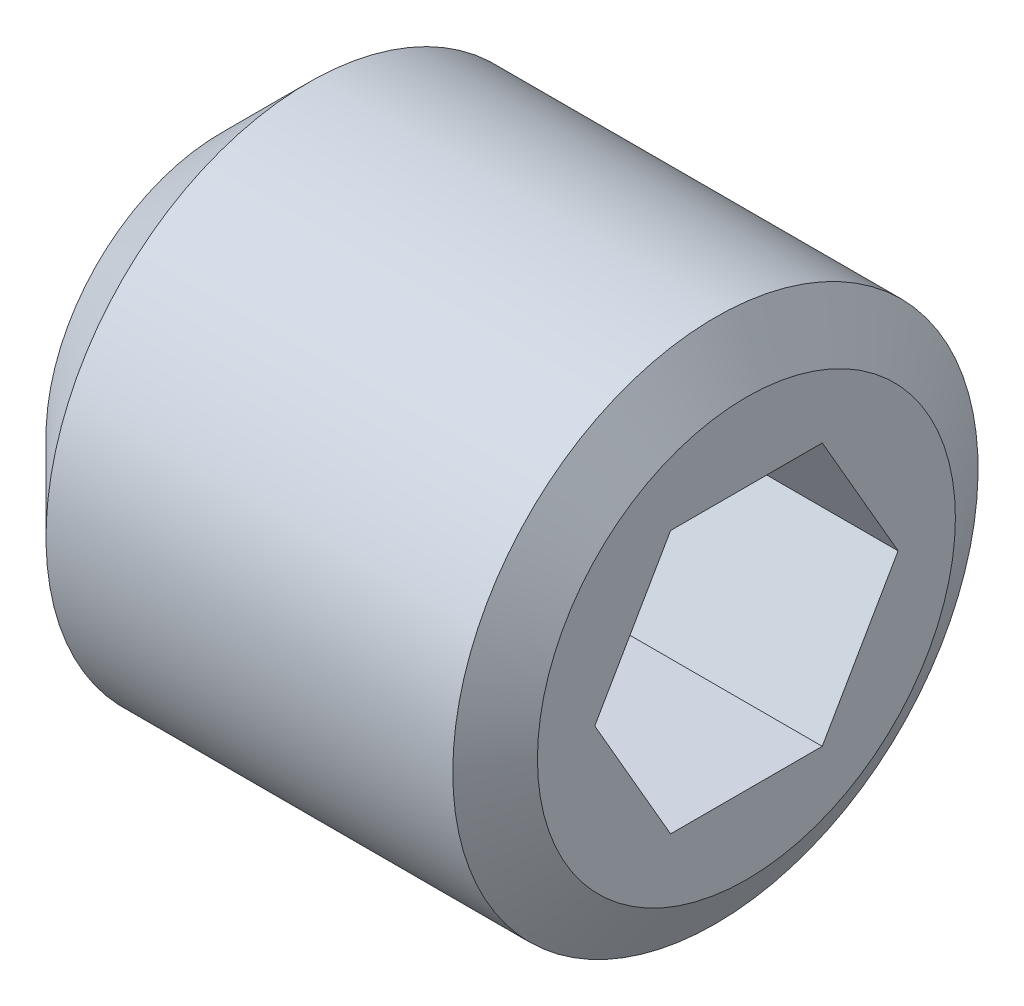
ISO-10303-21;
HEADER;
FILE_DESCRIPTION(('STEP AP214'),'2;1');
FILE_NAME('part.step','',(''),(''),'','','');
FILE_SCHEMA(('AUTOMOTIVE_DESIGN { 1 0 10303 214 1 1 1 1 }'));
ENDSEC;
DATA;
#1=APPLICATION_CONTEXT('core data for automotive mechanical design processes');
#2=APPLICATION_PROTOCOL_DEFINITION('international standard','automotive_design',2000,#1);
#3=PRODUCT_CONTEXT('',#1,'mechanical');
#4=PRODUCT('Part','Part','',(#3));
#5=PRODUCT_RELATED_PRODUCT_CATEGORY('part','',(#4));
#6=PRODUCT_DEFINITION_FORMATION('','',#4);
#7=PRODUCT_DEFINITION_CONTEXT('part definition',#1,'design');
#8=PRODUCT_DEFINITION('design','',#6,#7);
#9=PRODUCT_DEFINITION_SHAPE('','',#8);
#10=(LENGTH_UNIT() NAMED_UNIT(*) SI_UNIT(.MILLI.,.METRE.));
#11=(NAMED_UNIT(*) PLANE_ANGLE_UNIT() SI_UNIT($,.RADIAN.));
#12=(NAMED_UNIT(*) SI_UNIT($,.STERADIAN.) SOLID_ANGLE_UNIT());
#13=UNCERTAINTY_MEASURE_WITH_UNIT(LENGTH_MEASURE(1.E-05),#10,'distance_accuracy_value','');
#14=(GEOMETRIC_REPRESENTATION_CONTEXT(3) GLOBAL_UNCERTAINTY_ASSIGNED_CONTEXT((#13)) GLOBAL_UNIT_ASSIGNED_CONTEXT((#10,
#11,#12)) REPRESENTATION_CONTEXT('',''));
#15=CARTESIAN_POINT('',(0.,0.,0.));
#16=DIRECTION('',(0.,0.,1.));
#17=DIRECTION('',(1.,0.,0.));
#18=AXIS2_PLACEMENT_3D('',#15,#16,#17);
#19=CARTESIAN_POINT('',(1.8030007785228,0.,0.));
#20=DIRECTION('',(1.,0.,0.));
#21=DIRECTION('',(0.,0.,-1.));
#22=AXIS2_PLACEMENT_3D('',#19,#20,#21);
#23=CONICAL_SURFACE('',#22,0.871447499719181,1.04719754996775);
#24=CARTESIAN_POINT('',(1.80000000052929,-0.75019450614879,0.433124999847265));
#25=CARTESIAN_POINT('',(1.78973500393453,-0.75019450607153,0.397569732212472));
#26=CARTESIAN_POINT('',(1.78033710994484,-0.750194506039836,0.361733190852161));
#27=CARTESIAN_POINT('',(1.76372749838168,-0.750194506016601,0.289477968335062));
#28=CARTESIAN_POINT('',(1.75652067224446,-0.750194506025149,0.253058173000704));
#29=CARTESIAN_POINT('',(1.74493122333237,-0.750194506031242,0.180627245017424));
#30=CARTESIAN_POINT('',(1.74048681046706,-0.750194506029037,0.144626310065431));
#31=CARTESIAN_POINT('',(1.73452044980539,-0.750194506027426,0.0724167378183757));
#32=CARTESIAN_POINT('',(1.73299532977673,-0.750194506028015,0.0362083689083727));
#33=CARTESIAN_POINT('',(1.73299532977656,-0.750194506028447,-0.03620836891302));
#34=CARTESIAN_POINT('',(1.73452044980516,-0.750194506028289,-0.0724167378244096));
#35=CARTESIAN_POINT('',(1.74048681046847,-0.750194506028173,-0.144626310073646));
#36=CARTESIAN_POINT('',(1.74493122333547,-0.750194506028214,-0.180627245026433));
#37=CARTESIAN_POINT('',(1.75652067224474,-0.750194506028248,-0.253058173013071));
#38=CARTESIAN_POINT('',(1.7637274983773,-0.75019450602824,-0.28947796835003));
#39=CARTESIAN_POINT('',(1.78033710995589,-0.750194506028222,-0.361733190866283));
#40=CARTESIAN_POINT('',(1.78973500396563,-0.750194506028214,-0.397569732223154));
#41=CARTESIAN_POINT('',(1.80000000060822,-0.750194506028231,-0.433124999847262));
#42=B_SPLINE_CURVE_WITH_KNOTS('',3,(#24,#25,#26,#27,#28,#29,#30,#31,#32,#33,#34,#35,#36,#37,#38,
#39,#40,#41),.UNSPECIFIED.,.F.,.F.,(4,2,2,2,2,2,2,2,4),(0.,0.111056317466205,0.222358771597824,
0.331072410599408,0.439667849355641,0.548263288115687,0.656976927120826,0.768279381256422,
0.879335698727773),.UNSPECIFIED.);
#43=CARTESIAN_POINT('',(1.80000000060215,-0.750194505952962,0.433124999956606));
#44=VERTEX_POINT('',#43);
#45=CARTESIAN_POINT('',(1.80000000060215,-0.750194505952961,-0.433124999956601));
#46=VERTEX_POINT('',#45);
#47=EDGE_CURVE('E107',#44,#46,#42,.T.);
#48=ORIENTED_EDGE('',*,*,#47,.T.);
#49=CARTESIAN_POINT('',(1.80000000052929,-0.750194505956184,-0.433125000180862));
#50=CARTESIAN_POINT('',(1.78900797888272,-0.717228000924657,-0.452158220645845));
#51=CARTESIAN_POINT('',(1.77901131138609,-0.68397692932451,-0.471355735748436));
#52=CARTESIAN_POINT('',(1.76156242914315,-0.616899065951832,-0.510083158196485));
#53=CARTESIAN_POINT('',(1.75411638647812,-0.583071082723161,-0.529613753429577));
#54=CARTESIAN_POINT('',(1.74252608377005,-0.515834329634083,-0.568432910932016));
#55=CARTESIAN_POINT('',(1.73830467485833,-0.48243590210932,-0.587715502051405));
#56=CARTESIAN_POINT('',(1.7332661360862,-0.415481978381465,-0.626371367937135));
#57=CARTESIAN_POINT('',(1.73244483287884,-0.38192672537074,-0.645744502296295));
#58=CARTESIAN_POINT('',(1.73415778811296,-0.31923233487878,-0.681941125523941));
#59=CARTESIAN_POINT('',(1.73627145928134,-0.290083789592266,-0.698770045991449));
#60=CARTESIAN_POINT('',(1.74296920165886,-0.231976592282876,-0.732318251999771));
#61=CARTESIAN_POINT('',(1.74755555856444,-0.203018141087275,-0.749037421592904));
#62=CARTESIAN_POINT('',(1.75902056313261,-0.144791237470451,-0.782654740070188));
#63=CARTESIAN_POINT('',(1.76594778752534,-0.115530150732132,-0.799548636375329));
#64=CARTESIAN_POINT('',(1.78166965830922,-0.0574442801405555,-0.833084529397474));
#65=CARTESIAN_POINT('',(1.79046061305762,-0.0286187527141861,-0.849726955416613));
#66=CARTESIAN_POINT('',(1.80000000060772,-1.33824524092478E-10,-0.866249999922772));
#67=B_SPLINE_CURVE_WITH_KNOTS('',3,(#49,#50,#51,#52,#53,#54,#55,#56,#57,#58,#59,#60,#61,#62,#63,
#64,#65,#66),.UNSPECIFIED.,.F.,.F.,(4,2,2,2,2,2,2,2,4),(0.,0.118911835151596,0.2381094171165,
0.354357228103174,0.470462312189687,0.571538603718614,0.672708488550432,0.776121836634316,
0.879332227969691),.UNSPECIFIED.);
#68=CARTESIAN_POINT('',(1.80000000060219,1.06549945254002E-13,-0.8662499999132));
#69=VERTEX_POINT('',#68);
#70=EDGE_CURVE('E90',#46,#69,#67,.T.);
#71=ORIENTED_EDGE('',*,*,#70,.T.);
#72=CARTESIAN_POINT('',(1.80000000052935,1.92704234142296E-10,-0.866250000028126));
#73=CARTESIAN_POINT('',(1.78900797888277,0.0329665051469793,-0.847216779429332));
#74=CARTESIAN_POINT('',(1.77901131138614,0.0662175767154377,-0.828019264271846));
#75=CARTESIAN_POINT('',(1.7615624291432,0.133295440064887,-0.789291841783547));
#76=CARTESIAN_POINT('',(1.75411638647817,0.167123423302115,-0.769761246565267));
#77=CARTESIAN_POINT('',(1.7425260837701,0.234360176397283,-0.730942089073358));
#78=CARTESIAN_POINT('',(1.73830467485837,0.267758603919847,-0.711659497950152));
#79=CARTESIAN_POINT('',(1.73326613608624,0.334712527646109,-0.673003632061645));
#80=CARTESIAN_POINT('',(1.73244483287888,0.368267780657437,-0.653630497703521));
#81=CARTESIAN_POINT('',(1.734157788113,0.430962171149776,-0.617433874476522));
#82=CARTESIAN_POINT('',(1.73627145928139,0.460110716436162,-0.600604954008794));
#83=CARTESIAN_POINT('',(1.74296920165891,0.518217913745457,-0.567056748000309));
#84=CARTESIAN_POINT('',(1.74755555856448,0.547176364941091,-0.550337578407234));
#85=CARTESIAN_POINT('',(1.75902056313265,0.605403268557943,-0.516720259929997));
#86=CARTESIAN_POINT('',(1.76594778752538,0.634664355296254,-0.499826363624844));
#87=CARTESIAN_POINT('',(1.78166965830927,0.692750225887817,-0.466290470602676));
#88=CARTESIAN_POINT('',(1.79046061305766,0.721575753314179,-0.449648044583524));
#89=CARTESIAN_POINT('',(1.80000000060776,0.750194505894554,-0.433125000077389));
#90=B_SPLINE_CURVE_WITH_KNOTS('',3,(#72,#73,#74,#75,#76,#77,#78,#79,#80,#81,#82,#83,#84,#85,#86,
#87,#88,#89),.UNSPECIFIED.,.F.,.F.,(4,2,2,2,2,2,2,2,4),(0.,0.11891183515161,0.238109417116527,
0.354357228103215,0.470462312189741,0.571538603718667,0.672708488550483,0.776121836634368,
0.879332227969741),.UNSPECIFIED.);
#91=CARTESIAN_POINT('',(1.80000000060222,0.750194505953217,-0.433124999956605));
#92=VERTEX_POINT('',#91);
#93=EDGE_CURVE('E87',#69,#92,#90,.T.);
#94=ORIENTED_EDGE('',*,*,#93,.T.);
#95=CARTESIAN_POINT('',(1.80000000052936,0.750194506149042,-0.433124999847266));
#96=CARTESIAN_POINT('',(1.7897350039346,0.750194506071784,-0.397569732212473));
#97=CARTESIAN_POINT('',(1.78033710994491,0.75019450604009,-0.361733190852163));
#98=CARTESIAN_POINT('',(1.76372749838176,0.750194506016855,-0.289477968335064));
#99=CARTESIAN_POINT('',(1.75652067224453,0.750194506025403,-0.253058173000706));
#100=CARTESIAN_POINT('',(1.74493122333245,0.750194506031496,-0.180627245017427));
#101=CARTESIAN_POINT('',(1.74048681046714,0.750194506029291,-0.144626310065434));
#102=CARTESIAN_POINT('',(1.73452044980547,0.75019450602768,-0.0724167378183801));
#103=CARTESIAN_POINT('',(1.73299532977681,0.750194506028269,-0.0362083689083774));
#104=CARTESIAN_POINT('',(1.73299532977664,0.750194506028701,0.0362083689130154));
#105=CARTESIAN_POINT('',(1.73452044980524,0.750194506028543,0.0724167378244055));
#106=CARTESIAN_POINT('',(1.74048681046855,0.750194506028427,0.144626310073643));
#107=CARTESIAN_POINT('',(1.74493122333555,0.750194506028468,0.180627245026431));
#108=CARTESIAN_POINT('',(1.75652067224481,0.750194506028502,0.25305817301307));
#109=CARTESIAN_POINT('',(1.76372749837738,0.750194506028494,0.289477968350029));
#110=CARTESIAN_POINT('',(1.78033710995596,0.750194506028476,0.361733190866283));
#111=CARTESIAN_POINT('',(1.7897350039657,0.750194506028468,0.397569732223155));
#112=CARTESIAN_POINT('',(1.80000000060829,0.750194506028485,0.433124999847263));
#113=B_SPLINE_CURVE_WITH_KNOTS('',3,(#95,#96,#97,#98,#99,#100,#101,#102,#103,#104,#105,#106,
#107,#108,#109,#110,#111,#112),.UNSPECIFIED.,.F.,.F.,(4,2,2,2,2,2,2,2,4),(0.,0.111056317466204,
0.222358771597821,0.331072410599403,0.439667849355635,0.548263288115682,0.656976927120823,
0.76827938125642,0.879335698727771),.UNSPECIFIED.);
#114=CARTESIAN_POINT('',(1.80000000062731,0.750194506028485,0.433124999913145));
#115=VERTEX_POINT('',#114);
#116=EDGE_CURVE('E21',#92,#115,#113,.T.);
#117=ORIENTED_EDGE('',*,*,#116,.T.);
#118=CARTESIAN_POINT('',(1.80000000052936,0.750194505956439,0.433125000180861));
#119=CARTESIAN_POINT('',(1.78900797888279,0.717228000924908,0.452158220645846));
#120=CARTESIAN_POINT('',(1.77901131138616,0.683976929324757,0.471355735748441));
#121=CARTESIAN_POINT('',(1.76156242914321,0.61689906595207,0.510083158196494));
#122=CARTESIAN_POINT('',(1.75411638647818,0.583071082723394,0.529613753429588));
#123=CARTESIAN_POINT('',(1.7425260837701,0.515834329634307,0.568432910932033));
#124=CARTESIAN_POINT('',(1.73830467485838,0.48243590210954,0.587715502051424));
#125=CARTESIAN_POINT('',(1.73326613608624,0.415481978381676,0.62637136793716));
#126=CARTESIAN_POINT('',(1.73244483287888,0.381926725370947,0.645744502296323));
#127=CARTESIAN_POINT('',(1.73415778811299,0.319232334878983,0.68194112552397));
#128=CARTESIAN_POINT('',(1.73627145928138,0.290083789592471,0.698770045991477));
#129=CARTESIAN_POINT('',(1.74296920165889,0.231976592283086,0.732318251999796));
#130=CARTESIAN_POINT('',(1.74755555856447,0.203018141087487,0.749037421592929));
#131=CARTESIAN_POINT('',(1.75902056313263,0.144791237470666,0.78265474007021));
#132=CARTESIAN_POINT('',(1.76594778752536,0.115530150732349,0.79954863637535));
#133=CARTESIAN_POINT('',(1.78166965830924,0.057444280140776,0.833084529397493));
#134=CARTESIAN_POINT('',(1.79046061305763,0.0286187527144083,0.849726955416631));
#135=CARTESIAN_POINT('',(1.80000000060773,1.34048395759484E-10,0.86624999992279));
#136=B_SPLINE_CURVE_WITH_KNOTS('',3,(#118,#119,#120,#121,#122,#123,#124,#125,#126,#127,#128,
#129,#130,#131,#132,#133,#134,#135),.UNSPECIFIED.,.F.,.F.,(4,2,2,2,2,2,2,2,4),(0.,
0.118911835151612,0.238109417116533,0.354357228103224,0.470462312189753,0.571538603718672,
0.672708488550483,0.77612183663436,0.879332227969726),.UNSPECIFIED.);
#137=CARTESIAN_POINT('',(1.80000000060219,1.16941508169521E-13,0.8662499999132));
#138=VERTEX_POINT('',#137);
#139=EDGE_CURVE('E116',#115,#138,#136,.T.);
#140=ORIENTED_EDGE('',*,*,#139,.T.);
#141=CARTESIAN_POINT('',(1.80000000052933,-1.92484257966868E-10,0.86625000002812));
#142=CARTESIAN_POINT('',(1.78900797888276,-0.0329665051467544,0.84721677942932));
#143=CARTESIAN_POINT('',(1.77901131138613,-0.0662175767152096,0.828019264271832));
#144=CARTESIAN_POINT('',(1.76156242914318,-0.133295440064654,0.789291841783533));
#145=CARTESIAN_POINT('',(1.75411638647815,-0.167123423301881,0.769761246565254));
#146=CARTESIAN_POINT('',(1.74252608377007,-0.234360176397046,0.730942089073348));
#147=CARTESIAN_POINT('',(1.73830467485834,-0.267758603919609,0.711659497950143));
#148=CARTESIAN_POINT('',(1.73326613608621,-0.334712527645868,0.673003632061638));
#149=CARTESIAN_POINT('',(1.73244483287884,-0.368267780657194,0.653630497703514));
#150=CARTESIAN_POINT('',(1.73415778811296,-0.430962171149531,0.617433874476517));
#151=CARTESIAN_POINT('',(1.73627145928134,-0.460110716435916,0.60060495400879));
#152=CARTESIAN_POINT('',(1.74296920165885,-0.518217913745209,0.567056748000306));
#153=CARTESIAN_POINT('',(1.74755555856443,-0.547176364940842,0.550337578407231));
#154=CARTESIAN_POINT('',(1.75902056313259,-0.605403268557692,0.516720259929996));
#155=CARTESIAN_POINT('',(1.76594778752532,-0.634664355296002,0.499826363624844));
#156=CARTESIAN_POINT('',(1.7816696583092,-0.692750225887563,0.466290470602676));
#157=CARTESIAN_POINT('',(1.79046061305759,-0.721575753313925,0.449648044583526));
#158=CARTESIAN_POINT('',(1.80000000060769,-0.750194505894299,0.433125000077391));
#159=B_SPLINE_CURVE_WITH_KNOTS('',3,(#141,#142,#143,#144,#145,#146,#147,#148,#149,#150,#151,
#152,#153,#154,#155,#156,#157,#158),.UNSPECIFIED.,.F.,.F.,(4,2,2,2,2,2,2,2,4),(0.,
0.118911835151605,0.238109417116518,0.354357228103201,0.470462312189723,0.571538603718644,
0.672708488550457,0.776121836634336,0.879332227969706),.UNSPECIFIED.);
#160=EDGE_CURVE('E112',#138,#44,#159,.T.);
#161=ORIENTED_EDGE('',*,*,#160,.T.);
#162=EDGE_LOOP('',(#48,#71,#94,#117,#140,#161));
#163=FACE_BOUND('',#162,.T.);
#164=CARTESIAN_POINT('',(1.29987032855183,-1.4210854715202E-10,0.));
#165=VERTEX_POINT('',#164);
#166=VERTEX_LOOP('',#165);
#167=FACE_BOUND('',#166,.T.);
#168=ADVANCED_FACE('F17',(#163,#167),#23,.F.);
#169=CARTESIAN_POINT('',(2.99999999999996,0.750194506028485,-0.433125000000058));
#170=DIRECTION('',(0.,1.,0.));
#171=DIRECTION('',(0.,0.,1.));
#172=AXIS2_PLACEMENT_3D('',#169,#170,#171);
#173=PLANE('',#172);
#174=DIRECTION('',(1.,0.,0.));
#175=VECTOR('',#174,1.);
#176=CARTESIAN_POINT('',(2.99999999999996,0.750194506028488,-0.433125000000063));
#177=LINE('',#176,#175);
#178=CARTESIAN_POINT('',(2.99999999999998,0.750194506028486,-0.43312500000006));
#179=VERTEX_POINT('',#178);
#180=EDGE_CURVE('E79',#92,#179,#177,.T.);
#181=ORIENTED_EDGE('',*,*,#180,.T.);
#182=DIRECTION('',(0.,0.,-1.));
#183=VECTOR('',#182,1.);
#184=CARTESIAN_POINT('',(2.99999999999999,0.750194506028485,0.));
#185=LINE('',#184,#183);
#186=CARTESIAN_POINT('',(2.99999999999996,0.750194506028485,0.433125000000058));
#187=VERTEX_POINT('',#186);
#188=EDGE_CURVE('E125',#187,#179,#185,.T.);
#189=ORIENTED_EDGE('',*,*,#188,.F.);
#190=DIRECTION('',(1.,0.,0.));
#191=VECTOR('',#190,1.);
#192=CARTESIAN_POINT('',(2.99999999999996,0.750194506028485,0.433125000000058));
#193=LINE('',#192,#191);
#194=EDGE_CURVE('E82',#187,#115,#193,.F.);
#195=ORIENTED_EDGE('',*,*,#194,.T.);
#196=ORIENTED_EDGE('',*,*,#116,.F.);
#197=EDGE_LOOP('',(#181,#189,#195,#196));
#198=FACE_BOUND('',#197,.T.);
#199=ADVANCED_FACE('F76',(#198),#173,.F.);
#200=CARTESIAN_POINT('',(2.99999999999996,1.278976868E-13,-0.866250000000117));
#201=DIRECTION('',(0.,0.500000000000002,-0.866025403784438));
#202=DIRECTION('',(0.,0.866025403784438,0.500000000000002));
#203=AXIS2_PLACEMENT_3D('',#200,#201,#202);
#204=PLANE('',#203);
#205=DIRECTION('',(1.,0.,0.));
#206=VECTOR('',#205,1.);
#207=CARTESIAN_POINT('',(2.99999999999996,1.2045486136314E-13,-0.866250000000105));
#208=LINE('',#207,#206);
#209=CARTESIAN_POINT('',(2.99999999999998,1.22869670031558E-13,-0.86625000000011));
#210=VERTEX_POINT('',#209);
#211=EDGE_CURVE('E93',#69,#210,#208,.T.);
#212=ORIENTED_EDGE('',*,*,#211,.T.);
#213=DIRECTION('',(0.,-0.866025403784435,-0.500000000000007));
#214=VECTOR('',#213,1.);
#215=CARTESIAN_POINT('',(2.99999999999999,0.750194506028485,-0.433125000000058));
#216=LINE('',#215,#214);
#217=EDGE_CURVE('E96',#179,#210,#216,.T.);
#218=ORIENTED_EDGE('',*,*,#217,.F.);
#219=ORIENTED_EDGE('',*,*,#180,.F.);
#220=ORIENTED_EDGE('',*,*,#93,.F.);
#221=EDGE_LOOP('',(#212,#218,#219,#220));
#222=FACE_BOUND('',#221,.T.);
#223=ADVANCED_FACE('F94',(#222),#204,.F.);
#224=CARTESIAN_POINT('',(2.99999999999996,-0.750194506028231,-0.433125000000058));
#225=DIRECTION('',(0.,-0.5,-0.866025403784439));
#226=DIRECTION('',(0.,0.866025403784439,-0.5));
#227=AXIS2_PLACEMENT_3D('',#224,#225,#226);
#228=PLANE('',#227);
#229=DIRECTION('',(1.,0.,0.));
#230=VECTOR('',#229,1.);
#231=CARTESIAN_POINT('',(2.99999999999996,-0.750194506028231,-0.433125000000058));
#232=LINE('',#231,#230);
#233=CARTESIAN_POINT('',(2.99999999999998,-0.750194506028231,-0.433125000000058));
#234=VERTEX_POINT('',#233);
#235=EDGE_CURVE('E105',#46,#234,#232,.T.);
#236=ORIENTED_EDGE('',*,*,#235,.T.);
#237=DIRECTION('',(0.,-0.866025403784435,0.500000000000006));
#238=VECTOR('',#237,1.);
#239=CARTESIAN_POINT('',(2.99999999999999,1.2793585635329E-13,-0.866250000000117));
#240=LINE('',#239,#238);
#241=EDGE_CURVE('E143',#210,#234,#240,.T.);
#242=ORIENTED_EDGE('',*,*,#241,.F.);
#243=ORIENTED_EDGE('',*,*,#211,.F.);
#244=ORIENTED_EDGE('',*,*,#70,.F.);
#245=EDGE_LOOP('',(#236,#242,#243,#244));
#246=FACE_BOUND('',#245,.T.);
#247=ADVANCED_FACE('F193',(#246),#228,.F.);
#248=CARTESIAN_POINT('',(2.99999999999996,-0.750194506028231,0.433125000000058));
#249=DIRECTION('',(0.,-1.,0.));
#250=DIRECTION('',(0.,0.,-1.));
#251=AXIS2_PLACEMENT_3D('',#248,#249,#250);
#252=PLANE('',#251);
#253=DIRECTION('',(1.,0.,0.));
#254=VECTOR('',#253,1.);
#255=CARTESIAN_POINT('',(2.99999999999996,-0.750194506028234,0.433125000000064));
#256=LINE('',#255,#254);
#257=CARTESIAN_POINT('',(2.99999999999998,-0.750194506028233,0.433125000000061));
#258=VERTEX_POINT('',#257);
#259=EDGE_CURVE('E110',#44,#258,#256,.T.);
#260=ORIENTED_EDGE('',*,*,#259,.T.);
#261=DIRECTION('',(0.,0.,-1.));
#262=VECTOR('',#261,1.);
#263=CARTESIAN_POINT('',(2.99999999999999,-0.750194506028231,0.));
#264=LINE('',#263,#262);
#265=EDGE_CURVE('E138',#234,#258,#264,.F.);
#266=ORIENTED_EDGE('',*,*,#265,.F.);
#267=ORIENTED_EDGE('',*,*,#235,.F.);
#268=ORIENTED_EDGE('',*,*,#47,.F.);
#269=EDGE_LOOP('',(#260,#266,#267,#268));
#270=FACE_BOUND('',#269,.T.);
#271=ADVANCED_FACE('F196',(#270),#252,.F.);
#272=CARTESIAN_POINT('',(2.99999999999996,1.278976868E-13,0.866250000000117));
#273=DIRECTION('',(0.,-0.5,0.866025403784439));
#274=DIRECTION('',(0.,-0.866025403784439,-0.5));
#275=AXIS2_PLACEMENT_3D('',#272,#273,#274);
#276=PLANE('',#275);
#277=DIRECTION('',(1.,0.,0.));
#278=VECTOR('',#277,1.);
#279=CARTESIAN_POINT('',(2.99999999999996,1.13732807893729E-13,0.866250000000117));
#280=LINE('',#279,#278);
#281=CARTESIAN_POINT('',(2.99999999999998,1.19511226574926E-13,0.866250000000117));
#282=VERTEX_POINT('',#281);
#283=EDGE_CURVE('E41',#138,#282,#280,.T.);
#284=ORIENTED_EDGE('',*,*,#283,.T.);
#285=DIRECTION('',(0.,0.866025403784435,0.500000000000006));
#286=VECTOR('',#285,1.);
#287=CARTESIAN_POINT('',(2.99999999999999,-0.750194506028231,0.433125000000058));
#288=LINE('',#287,#286);
#289=EDGE_CURVE('E133',#258,#282,#288,.T.);
#290=ORIENTED_EDGE('',*,*,#289,.F.);
#291=ORIENTED_EDGE('',*,*,#259,.F.);
#292=ORIENTED_EDGE('',*,*,#160,.F.);
#293=EDGE_LOOP('',(#284,#290,#291,#292));
#294=FACE_BOUND('',#293,.T.);
#295=ADVANCED_FACE('F200',(#294),#276,.F.);
#296=CARTESIAN_POINT('',(2.99999999999996,0.750194506028485,0.433125000000058));
#297=DIRECTION('',(0.,0.5,0.866025403784439));
#298=DIRECTION('',(0.,-0.866025403784439,0.5));
#299=AXIS2_PLACEMENT_3D('',#296,#297,#298);
#300=PLANE('',#299);
#301=ORIENTED_EDGE('',*,*,#194,.F.);
#302=DIRECTION('',(0.,0.866025403784435,-0.500000000000007));
#303=VECTOR('',#302,1.);
#304=CARTESIAN_POINT('',(2.99999999999999,1.2793585635329E-13,0.866250000000117));
#305=LINE('',#304,#303);
#306=EDGE_CURVE('E129',#282,#187,#305,.T.);
#307=ORIENTED_EDGE('',*,*,#306,.F.);
#308=ORIENTED_EDGE('',*,*,#283,.F.);
#309=ORIENTED_EDGE('',*,*,#139,.F.);
#310=EDGE_LOOP('',(#301,#307,#308,#309));
#311=FACE_BOUND('',#310,.T.);
#312=ADVANCED_FACE('F167',(#311),#300,.F.);
#313=CARTESIAN_POINT('',(2.99999999999999,-1.02987500000001,0.));
#314=DIRECTION('',(1.,0.,0.));
#315=DIRECTION('',(0.,0.,-1.));
#316=AXIS2_PLACEMENT_3D('',#313,#314,#315);
#317=PLANE('',#316);
#318=ORIENTED_EDGE('',*,*,#289,.T.);
#319=ORIENTED_EDGE('',*,*,#306,.T.);
#320=ORIENTED_EDGE('',*,*,#188,.T.);
#321=ORIENTED_EDGE('',*,*,#217,.T.);
#322=ORIENTED_EDGE('',*,*,#241,.T.);
#323=ORIENTED_EDGE('',*,*,#265,.T.);
#324=EDGE_LOOP('',(#318,#319,#320,#321,#322,#323));
#325=FACE_BOUND('',#324,.T.);
#326=CARTESIAN_POINT('',(3.00000000022851,0.,0.));
#327=DIRECTION('',(-1.,0.,0.));
#328=DIRECTION('',(0.,0.,1.));
#329=AXIS2_PLACEMENT_3D('',#326,#327,#328);
#330=CIRCLE('',#329,1.19350000016999);
#331=CARTESIAN_POINT('',(3.00000000022851,0.,1.19350000016999));
#332=VERTEX_POINT('',#331);
#333=EDGE_CURVE('E132',#332,#332,#330,.T.);
#334=ORIENTED_EDGE('',*,*,#333,.F.);
#335=EDGE_LOOP('',(#334));
#336=FACE_BOUND('',#335,.T.);
#337=ADVANCED_FACE('F208',(#325,#336),#317,.T.);
#338=CARTESIAN_POINT('',(0.,-0.500000000000007,0.));
#339=DIRECTION('',(-1.,0.,0.));
#340=DIRECTION('',(0.,0.,1.));
#341=AXIS2_PLACEMENT_3D('',#338,#339,#340);
#342=PLANE('',#341);
#343=CARTESIAN_POINT('',(-2.8421709430404E-10,0.,0.));
#344=DIRECTION('',(1.,0.,0.));
#345=DIRECTION('',(0.,0.,-1.));
#346=AXIS2_PLACEMENT_3D('',#343,#344,#345);
#347=CIRCLE('',#346,1.00000000020378);
#348=CARTESIAN_POINT('',(-2.8421709430404E-10,0.,-1.00000000020378));
#349=VERTEX_POINT('',#348);
#350=EDGE_CURVE('E123',#349,#349,#347,.T.);
#351=ORIENTED_EDGE('',*,*,#350,.F.);
#352=EDGE_LOOP('',(#351));
#353=FACE_BOUND('',#352,.T.);
#354=ADVANCED_FACE('F224',(#353),#342,.T.);
#355=CARTESIAN_POINT('',(2.82304214243823,0.,0.));
#356=DIRECTION('',(-1.,0.,0.));
#357=DIRECTION('',(0.,0.,1.));
#358=AXIS2_PLACEMENT_3D('',#355,#356,#357);
#359=CONICAL_SURFACE('',#358,1.49999999973721,1.04719754989107);
#360=ORIENTED_EDGE('',*,*,#333,.T.);
#361=EDGE_LOOP('',(#360));
#362=FACE_BOUND('',#361,.T.);
#363=CARTESIAN_POINT('',(2.8230421424934,0.,0.));
#364=DIRECTION('',(-1.,0.,0.));
#365=DIRECTION('',(0.,-1.,0.));
#366=AXIS2_PLACEMENT_3D('',#363,#364,#365);
#367=CIRCLE('',#366,1.50000000000005);
#368=CARTESIAN_POINT('',(2.8230421424934,-1.49999999999999,0.));
#369=VERTEX_POINT('',#368);
#370=EDGE_CURVE('E32',#369,#369,#367,.T.);
#371=ORIENTED_EDGE('',*,*,#370,.F.);
#372=EDGE_LOOP('',(#371));
#373=FACE_BOUND('',#372,.T.);
#374=ADVANCED_FACE('F216',(#362,#373),#359,.T.);
#375=CARTESIAN_POINT('',(0.500000000101863,0.,0.));
#376=DIRECTION('',(1.,0.,0.));
#377=DIRECTION('',(0.,0.,-1.));
#378=AXIS2_PLACEMENT_3D('',#375,#376,#377);
#379=CONICAL_SURFACE('',#378,1.49999999968037,0.785398162487954);
#380=ORIENTED_EDGE('',*,*,#350,.T.);
#381=EDGE_LOOP('',(#380));
#382=FACE_BOUND('',#381,.T.);
#383=CARTESIAN_POINT('',(0.49999999999993,0.,0.));
#384=DIRECTION('',(-1.,0.,0.));
#385=DIRECTION('',(0.,-1.,0.));
#386=AXIS2_PLACEMENT_3D('',#383,#384,#385);
#387=CIRCLE('',#386,1.50000000000005);
#388=CARTESIAN_POINT('',(0.49999999999993,-1.49999999999999,0.));
#389=VERTEX_POINT('',#388);
#390=EDGE_CURVE('E11',#389,#389,#387,.F.);
#391=ORIENTED_EDGE('',*,*,#390,.F.);
#392=EDGE_LOOP('',(#391));
#393=FACE_BOUND('',#392,.T.);
#394=ADVANCED_FACE('F211',(#382,#393),#379,.T.);
#395=CARTESIAN_POINT('',(2.8230421424934,0.,0.));
#396=DIRECTION('',(-1.,0.,0.));
#397=DIRECTION('',(0.,0.,1.));
#398=AXIS2_PLACEMENT_3D('',#395,#396,#397);
#399=CYLINDRICAL_SURFACE('',#398,1.50000000000005);
#400=ORIENTED_EDGE('',*,*,#370,.T.);
#401=EDGE_LOOP('',(#400));
#402=FACE_BOUND('',#401,.T.);
#403=ORIENTED_EDGE('',*,*,#390,.T.);
#404=EDGE_LOOP('',(#403));
#405=FACE_BOUND('',#404,.T.);
#406=ADVANCED_FACE('F19',(#402,#405),#399,.T.);
#407=CLOSED_SHELL('',(#168,#199,#223,#247,#271,#295,#312,#337,#354,#374,#394,#406));
#408=MANIFOLD_SOLID_BREP('B1',#407);
#409=ADVANCED_BREP_SHAPE_REPRESENTATION('',(#18,#408),#14);
#410=SHAPE_DEFINITION_REPRESENTATION(#9,#409);
ENDSEC;
END-ISO-10303-21;
